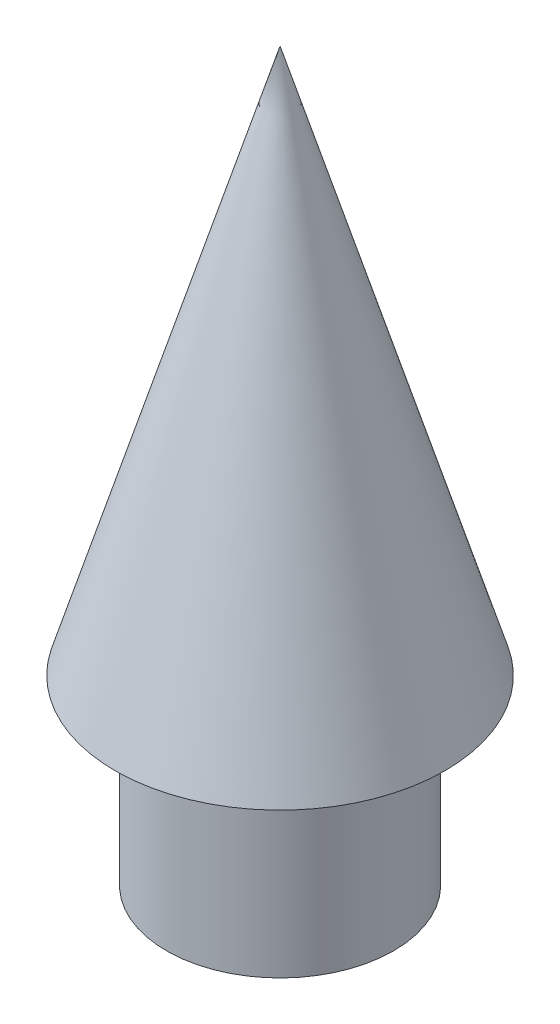
ISO-10303-21;
HEADER;
FILE_DESCRIPTION(('STEP AP214'),'2;1');
FILE_NAME('part.step','',(''),(''),'','','');
FILE_SCHEMA(('AUTOMOTIVE_DESIGN { 1 0 10303 214 1 1 1 1 }'));
ENDSEC;
DATA;
#1=APPLICATION_CONTEXT('core data for automotive mechanical design processes');
#2=APPLICATION_PROTOCOL_DEFINITION('international standard','automotive_design',2000,#1);
#3=PRODUCT_CONTEXT('',#1,'mechanical');
#4=PRODUCT('Part','Part','',(#3));
#5=PRODUCT_RELATED_PRODUCT_CATEGORY('part','',(#4));
#6=PRODUCT_DEFINITION_FORMATION('','',#4);
#7=PRODUCT_DEFINITION_CONTEXT('part definition',#1,'design');
#8=PRODUCT_DEFINITION('design','',#6,#7);
#9=PRODUCT_DEFINITION_SHAPE('','',#8);
#10=(LENGTH_UNIT() NAMED_UNIT(*) SI_UNIT(.MILLI.,.METRE.));
#11=(NAMED_UNIT(*) PLANE_ANGLE_UNIT() SI_UNIT($,.RADIAN.));
#12=(NAMED_UNIT(*) SI_UNIT($,.STERADIAN.) SOLID_ANGLE_UNIT());
#13=UNCERTAINTY_MEASURE_WITH_UNIT(LENGTH_MEASURE(1.E-05),#10,'distance_accuracy_value','');
#14=(GEOMETRIC_REPRESENTATION_CONTEXT(3) GLOBAL_UNCERTAINTY_ASSIGNED_CONTEXT((#13)) GLOBAL_UNIT_ASSIGNED_CONTEXT((#10,
#11,#12)) REPRESENTATION_CONTEXT('',''));
#15=CARTESIAN_POINT('',(0.,0.,0.));
#16=DIRECTION('',(0.,0.,1.));
#17=DIRECTION('',(1.,0.,0.));
#18=AXIS2_PLACEMENT_3D('',#15,#16,#17);
#19=CARTESIAN_POINT('',(0.,4279.9,0.));
#20=DIRECTION('',(0.,-1.,0.));
#21=DIRECTION('',(1.,0.,0.));
#22=AXIS2_PLACEMENT_3D('',#19,#20,#21);
#23=CONICAL_SURFACE('',#22,0.,0.29390760941176);
#24=CARTESIAN_POINT('',(0.,4203.7,0.));
#25=DIRECTION('',(0.,-1.,0.));
#26=DIRECTION('',(1.,0.,0.));
#27=AXIS2_PLACEMENT_3D('',#24,#25,#26);
#28=CIRCLE('',#27,23.0637099712723);
#29=CARTESIAN_POINT('',(23.0637099712723,4203.7,0.));
#30=VERTEX_POINT('',#29);
#31=EDGE_CURVE('E11',#30,#30,#28,.T.);
#32=ORIENTED_EDGE('',*,*,#31,.F.);
#33=EDGE_LOOP('',(#32));
#34=FACE_BOUND('',#33,.T.);
#35=CARTESIAN_POINT('',(0.,4279.9,0.));
#36=VERTEX_POINT('',#35);
#37=VERTEX_LOOP('',#36);
#38=FACE_BOUND('',#37,.T.);
#39=ADVANCED_FACE('F32',(#34,#38),#23,.T.);
#40=CARTESIAN_POINT('',(-23.0637099712722,4203.7,0.));
#41=DIRECTION('',(0.,1.,0.));
#42=DIRECTION('',(-1.,0.,0.));
#43=AXIS2_PLACEMENT_3D('',#40,#41,#42);
#44=PLANE('',#43);
#45=CARTESIAN_POINT('',(0.,4203.7,0.));
#46=DIRECTION('',(0.,-1.,0.));
#47=DIRECTION('',(1.,0.,0.));
#48=AXIS2_PLACEMENT_3D('',#45,#46,#47);
#49=CIRCLE('',#48,15.875);
#50=CARTESIAN_POINT('',(15.875,4203.7,0.));
#51=VERTEX_POINT('',#50);
#52=EDGE_CURVE('E38',#51,#51,#49,.T.);
#53=ORIENTED_EDGE('',*,*,#52,.F.);
#54=EDGE_LOOP('',(#53));
#55=FACE_BOUND('',#54,.T.);
#56=ORIENTED_EDGE('',*,*,#31,.T.);
#57=EDGE_LOOP('',(#56));
#58=FACE_BOUND('',#57,.T.);
#59=ADVANCED_FACE('F42',(#55,#58),#44,.F.);
#60=CARTESIAN_POINT('',(0.,0.,0.));
#61=DIRECTION('',(0.,-1.,0.));
#62=DIRECTION('',(1.,0.,0.));
#63=AXIS2_PLACEMENT_3D('',#60,#61,#62);
#64=CYLINDRICAL_SURFACE('',#63,15.875);
#65=CARTESIAN_POINT('',(0.,4178.3,0.));
#66=DIRECTION('',(0.,-1.,0.));
#67=DIRECTION('',(1.,0.,0.));
#68=AXIS2_PLACEMENT_3D('',#65,#66,#67);
#69=CIRCLE('',#68,15.875);
#70=CARTESIAN_POINT('',(15.875,4178.3,0.));
#71=VERTEX_POINT('',#70);
#72=EDGE_CURVE('E65',#71,#71,#69,.T.);
#73=ORIENTED_EDGE('',*,*,#72,.F.);
#74=EDGE_LOOP('',(#73));
#75=FACE_BOUND('',#74,.T.);
#76=ORIENTED_EDGE('',*,*,#52,.T.);
#77=EDGE_LOOP('',(#76));
#78=FACE_BOUND('',#77,.T.);
#79=ADVANCED_FACE('F47',(#75,#78),#64,.T.);
#80=CARTESIAN_POINT('',(-15.875,4178.3,0.));
#81=DIRECTION('',(0.,1.,0.));
#82=DIRECTION('',(-1.,0.,0.));
#83=AXIS2_PLACEMENT_3D('',#80,#81,#82);
#84=PLANE('',#83);
#85=ORIENTED_EDGE('',*,*,#72,.T.);
#86=EDGE_LOOP('',(#85));
#87=FACE_BOUND('',#86,.T.);
#88=ADVANCED_FACE('F54',(#87),#84,.F.);
#89=CLOSED_SHELL('',(#39,#59,#79,#88));
#90=MANIFOLD_SOLID_BREP('B2',#89);
#91=ADVANCED_BREP_SHAPE_REPRESENTATION('',(#18,#90),#14);
#92=SHAPE_DEFINITION_REPRESENTATION(#9,#91);
ENDSEC;
END-ISO-10303-21;
